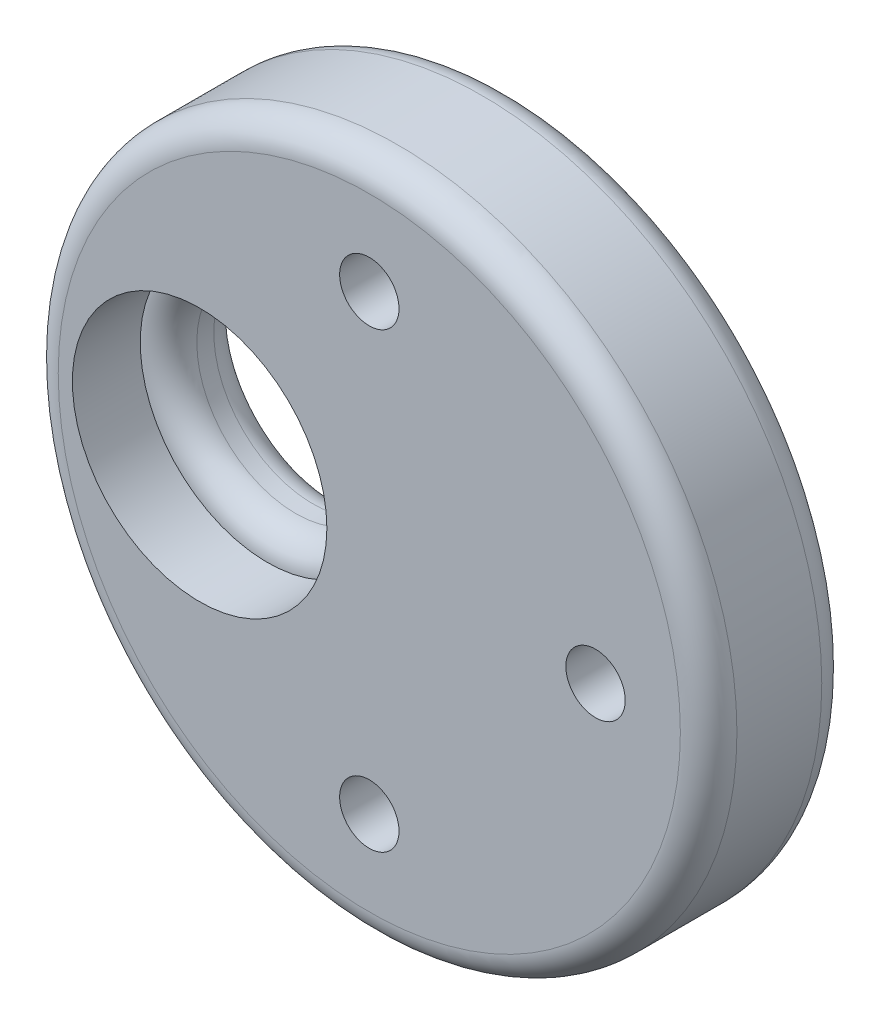
ISO-10303-21;
HEADER;
FILE_DESCRIPTION(('STEP AP214'),'2;1');
FILE_NAME('part.step','',(''),(''),'','','');
FILE_SCHEMA(('AUTOMOTIVE_DESIGN { 1 0 10303 214 1 1 1 1 }'));
ENDSEC;
DATA;
#1=APPLICATION_CONTEXT('core data for automotive mechanical design processes');
#2=APPLICATION_PROTOCOL_DEFINITION('international standard','automotive_design',2000,#1);
#3=PRODUCT_CONTEXT('',#1,'mechanical');
#4=PRODUCT('Part','Part','',(#3));
#5=PRODUCT_RELATED_PRODUCT_CATEGORY('part','',(#4));
#6=PRODUCT_DEFINITION_FORMATION('','',#4);
#7=PRODUCT_DEFINITION_CONTEXT('part definition',#1,'design');
#8=PRODUCT_DEFINITION('design','',#6,#7);
#9=PRODUCT_DEFINITION_SHAPE('','',#8);
#10=(LENGTH_UNIT() NAMED_UNIT(*) SI_UNIT(.MILLI.,.METRE.));
#11=(NAMED_UNIT(*) PLANE_ANGLE_UNIT() SI_UNIT($,.RADIAN.));
#12=(NAMED_UNIT(*) SI_UNIT($,.STERADIAN.) SOLID_ANGLE_UNIT());
#13=UNCERTAINTY_MEASURE_WITH_UNIT(LENGTH_MEASURE(1.E-05),#10,'distance_accuracy_value','');
#14=(GEOMETRIC_REPRESENTATION_CONTEXT(3) GLOBAL_UNCERTAINTY_ASSIGNED_CONTEXT((#13)) GLOBAL_UNIT_ASSIGNED_CONTEXT((#10,
#11,#12)) REPRESENTATION_CONTEXT('',''));
#15=CARTESIAN_POINT('',(0.,0.,0.));
#16=DIRECTION('',(0.,0.,1.));
#17=DIRECTION('',(1.,0.,0.));
#18=AXIS2_PLACEMENT_3D('',#15,#16,#17);
#19=CARTESIAN_POINT('',(8.00000000000028,1.62077717745761E-13,5.));
#20=DIRECTION('',(0.,0.,-1.));
#21=DIRECTION('',(-1.,0.,0.));
#22=AXIS2_PLACEMENT_3D('',#19,#20,#21);
#23=CYLINDRICAL_SURFACE('',#22,1.0500000000001);
#24=CARTESIAN_POINT('',(8.00000000000028,1.62077717745761E-13,5.));
#25=DIRECTION('',(0.,0.,1.));
#26=DIRECTION('',(1.,0.,0.));
#27=AXIS2_PLACEMENT_3D('',#24,#25,#26);
#28=CIRCLE('',#27,1.0500000000001);
#29=CARTESIAN_POINT('',(9.05000000000038,1.62077717745761E-13,5.));
#30=VERTEX_POINT('',#29);
#31=EDGE_CURVE('E77',#30,#30,#28,.T.);
#32=ORIENTED_EDGE('',*,*,#31,.T.);
#33=EDGE_LOOP('',(#32));
#34=FACE_BOUND('',#33,.T.);
#35=CARTESIAN_POINT('',(8.00000000000028,1.62077717745761E-13,3.));
#36=DIRECTION('',(0.,0.,-1.));
#37=DIRECTION('',(-1.,0.,0.));
#38=AXIS2_PLACEMENT_3D('',#35,#36,#37);
#39=CIRCLE('',#38,1.0500000000001);
#40=CARTESIAN_POINT('',(6.95000000000018,1.62077717745761E-13,3.));
#41=VERTEX_POINT('',#40);
#42=EDGE_CURVE('E60',#41,#41,#39,.T.);
#43=ORIENTED_EDGE('',*,*,#42,.T.);
#44=EDGE_LOOP('',(#43));
#45=FACE_BOUND('',#44,.T.);
#46=ADVANCED_FACE('F30',(#34,#45),#23,.F.);
#47=CARTESIAN_POINT('',(3.24155435491522E-13,-8.,5.));
#48=DIRECTION('',(0.,0.,-1.));
#49=DIRECTION('',(-1.,0.,0.));
#50=AXIS2_PLACEMENT_3D('',#47,#48,#49);
#51=CYLINDRICAL_SURFACE('',#50,1.05000000000036);
#52=CARTESIAN_POINT('',(3.24155435491522E-13,-8.,5.));
#53=DIRECTION('',(0.,0.,1.));
#54=DIRECTION('',(1.,0.,0.));
#55=AXIS2_PLACEMENT_3D('',#52,#53,#54);
#56=CIRCLE('',#55,1.05000000000036);
#57=CARTESIAN_POINT('',(1.05000000000069,-8.,5.));
#58=VERTEX_POINT('',#57);
#59=EDGE_CURVE('E80',#58,#58,#56,.T.);
#60=ORIENTED_EDGE('',*,*,#59,.T.);
#61=EDGE_LOOP('',(#60));
#62=FACE_BOUND('',#61,.T.);
#63=CARTESIAN_POINT('',(3.24155435491522E-13,-8.,3.));
#64=DIRECTION('',(0.,0.,-1.));
#65=DIRECTION('',(-1.,0.,0.));
#66=AXIS2_PLACEMENT_3D('',#63,#64,#65);
#67=CIRCLE('',#66,1.05000000000036);
#68=CARTESIAN_POINT('',(-1.05000000000004,-8.,3.));
#69=VERTEX_POINT('',#68);
#70=EDGE_CURVE('E65',#69,#69,#67,.T.);
#71=ORIENTED_EDGE('',*,*,#70,.T.);
#72=EDGE_LOOP('',(#71));
#73=FACE_BOUND('',#72,.T.);
#74=ADVANCED_FACE('F139',(#62,#73),#51,.F.);
#75=CARTESIAN_POINT('',(0.,8.,5.));
#76=DIRECTION('',(0.,0.,-1.));
#77=DIRECTION('',(-1.,0.,0.));
#78=AXIS2_PLACEMENT_3D('',#75,#76,#77);
#79=CYLINDRICAL_SURFACE('',#78,1.05);
#80=CARTESIAN_POINT('',(0.,8.,5.));
#81=DIRECTION('',(0.,0.,1.));
#82=DIRECTION('',(1.,0.,0.));
#83=AXIS2_PLACEMENT_3D('',#80,#81,#82);
#84=CIRCLE('',#83,1.05);
#85=CARTESIAN_POINT('',(1.05,8.,5.));
#86=VERTEX_POINT('',#85);
#87=EDGE_CURVE('E59',#86,#86,#84,.T.);
#88=ORIENTED_EDGE('',*,*,#87,.T.);
#89=EDGE_LOOP('',(#88));
#90=FACE_BOUND('',#89,.T.);
#91=CARTESIAN_POINT('',(0.,8.,3.));
#92=DIRECTION('',(0.,0.,-1.));
#93=DIRECTION('',(-1.,0.,0.));
#94=AXIS2_PLACEMENT_3D('',#91,#92,#93);
#95=CIRCLE('',#94,1.05);
#96=CARTESIAN_POINT('',(-1.05,8.,3.));
#97=VERTEX_POINT('',#96);
#98=EDGE_CURVE('E70',#97,#97,#95,.T.);
#99=ORIENTED_EDGE('',*,*,#98,.T.);
#100=EDGE_LOOP('',(#99));
#101=FACE_BOUND('',#100,.T.);
#102=ADVANCED_FACE('F145',(#90,#101),#79,.F.);
#103=CARTESIAN_POINT('',(0.,0.,5.));
#104=DIRECTION('',(0.,0.,1.));
#105=DIRECTION('',(1.,0.,0.));
#106=AXIS2_PLACEMENT_3D('',#103,#104,#105);
#107=PLANE('',#106);
#108=CARTESIAN_POINT('',(0.,0.,5.));
#109=DIRECTION('',(0.,0.,1.));
#110=DIRECTION('',(1.,0.,0.));
#111=AXIS2_PLACEMENT_3D('',#108,#109,#110);
#112=CIRCLE('',#111,11.);
#113=CARTESIAN_POINT('',(11.,0.,5.));
#114=VERTEX_POINT('',#113);
#115=EDGE_CURVE('E45',#114,#114,#112,.T.);
#116=ORIENTED_EDGE('',*,*,#115,.T.);
#117=EDGE_LOOP('',(#116));
#118=FACE_BOUND('',#117,.T.);
#119=CARTESIAN_POINT('',(-6.,0.,5.));
#120=DIRECTION('',(0.,0.,1.));
#121=DIRECTION('',(1.,0.,0.));
#122=AXIS2_PLACEMENT_3D('',#119,#120,#121);
#123=CIRCLE('',#122,4.50000000000001);
#124=CARTESIAN_POINT('',(-1.49999999999999,0.,5.));
#125=VERTEX_POINT('',#124);
#126=EDGE_CURVE('E73',#125,#125,#123,.T.);
#127=ORIENTED_EDGE('',*,*,#126,.F.);
#128=EDGE_LOOP('',(#127));
#129=FACE_BOUND('',#128,.T.);
#130=ORIENTED_EDGE('',*,*,#31,.F.);
#131=EDGE_LOOP('',(#130));
#132=FACE_BOUND('',#131,.T.);
#133=ORIENTED_EDGE('',*,*,#87,.F.);
#134=EDGE_LOOP('',(#133));
#135=FACE_BOUND('',#134,.T.);
#136=ORIENTED_EDGE('',*,*,#59,.F.);
#137=EDGE_LOOP('',(#136));
#138=FACE_BOUND('',#137,.T.);
#139=ADVANCED_FACE('F115',(#118,#129,#132,#135,#138),#107,.T.);
#140=CARTESIAN_POINT('',(0.,0.,0.));
#141=DIRECTION('',(0.,0.,1.));
#142=DIRECTION('',(1.,0.,0.));
#143=AXIS2_PLACEMENT_3D('',#140,#141,#142);
#144=PLANE('',#143);
#145=CARTESIAN_POINT('',(0.,0.,0.));
#146=DIRECTION('',(0.,0.,1.));
#147=DIRECTION('',(1.,0.,0.));
#148=AXIS2_PLACEMENT_3D('',#145,#146,#147);
#149=CIRCLE('',#148,11.);
#150=CARTESIAN_POINT('',(11.,0.,0.));
#151=VERTEX_POINT('',#150);
#152=EDGE_CURVE('E10',#151,#151,#149,.F.);
#153=ORIENTED_EDGE('',*,*,#152,.T.);
#154=EDGE_LOOP('',(#153));
#155=FACE_BOUND('',#154,.T.);
#156=CARTESIAN_POINT('',(-6.,0.,0.));
#157=DIRECTION('',(0.,0.,1.));
#158=DIRECTION('',(1.,0.,0.));
#159=AXIS2_PLACEMENT_3D('',#156,#157,#158);
#160=CIRCLE('',#159,4.50000000000001);
#161=CARTESIAN_POINT('',(-1.49999999999999,0.,0.));
#162=VERTEX_POINT('',#161);
#163=EDGE_CURVE('E50',#162,#162,#160,.T.);
#164=ORIENTED_EDGE('',*,*,#163,.T.);
#165=EDGE_LOOP('',(#164));
#166=FACE_BOUND('',#165,.T.);
#167=CARTESIAN_POINT('',(8.00000000000028,1.62077717745761E-13,0.));
#168=DIRECTION('',(0.,0.,-1.));
#169=DIRECTION('',(-1.,0.,0.));
#170=AXIS2_PLACEMENT_3D('',#167,#168,#169);
#171=CIRCLE('',#170,2.15);
#172=CARTESIAN_POINT('',(5.85000000000028,1.62077717745761E-13,0.));
#173=VERTEX_POINT('',#172);
#174=EDGE_CURVE('E96',#173,#173,#171,.T.);
#175=ORIENTED_EDGE('',*,*,#174,.F.);
#176=EDGE_LOOP('',(#175));
#177=FACE_BOUND('',#176,.T.);
#178=CARTESIAN_POINT('',(3.24155435491522E-13,-8.,0.));
#179=DIRECTION('',(0.,0.,-1.));
#180=DIRECTION('',(-1.,0.,0.));
#181=AXIS2_PLACEMENT_3D('',#178,#179,#180);
#182=CIRCLE('',#181,2.15);
#183=CARTESIAN_POINT('',(-2.14999999999968,-8.,0.));
#184=VERTEX_POINT('',#183);
#185=EDGE_CURVE('E63',#184,#184,#182,.T.);
#186=ORIENTED_EDGE('',*,*,#185,.F.);
#187=EDGE_LOOP('',(#186));
#188=FACE_BOUND('',#187,.T.);
#189=CARTESIAN_POINT('',(0.,8.,0.));
#190=DIRECTION('',(0.,0.,-1.));
#191=DIRECTION('',(-1.,0.,0.));
#192=AXIS2_PLACEMENT_3D('',#189,#190,#191);
#193=CIRCLE('',#192,2.15);
#194=CARTESIAN_POINT('',(-2.15,8.,0.));
#195=VERTEX_POINT('',#194);
#196=EDGE_CURVE('E68',#195,#195,#193,.T.);
#197=ORIENTED_EDGE('',*,*,#196,.F.);
#198=EDGE_LOOP('',(#197));
#199=FACE_BOUND('',#198,.T.);
#200=ADVANCED_FACE('F111',(#155,#166,#177,#188,#199),#144,.F.);
#201=CARTESIAN_POINT('',(0.,0.,5.));
#202=DIRECTION('',(0.,0.,-1.));
#203=DIRECTION('',(-1.,0.,0.));
#204=AXIS2_PLACEMENT_3D('',#201,#202,#203);
#205=CYLINDRICAL_SURFACE('',#204,12.);
#206=CARTESIAN_POINT('',(0.,0.,4.));
#207=DIRECTION('',(0.,0.,1.));
#208=DIRECTION('',(1.,0.,0.));
#209=AXIS2_PLACEMENT_3D('',#206,#207,#208);
#210=CIRCLE('',#209,12.);
#211=CARTESIAN_POINT('',(12.,0.,4.));
#212=VERTEX_POINT('',#211);
#213=EDGE_CURVE('E37',#212,#212,#210,.F.);
#214=ORIENTED_EDGE('',*,*,#213,.T.);
#215=EDGE_LOOP('',(#214));
#216=FACE_BOUND('',#215,.T.);
#217=CARTESIAN_POINT('',(0.,0.,1.));
#218=DIRECTION('',(0.,0.,1.));
#219=DIRECTION('',(1.,0.,0.));
#220=AXIS2_PLACEMENT_3D('',#217,#218,#219);
#221=CIRCLE('',#220,12.);
#222=CARTESIAN_POINT('',(12.,0.,1.));
#223=VERTEX_POINT('',#222);
#224=EDGE_CURVE('E41',#223,#223,#221,.T.);
#225=ORIENTED_EDGE('',*,*,#224,.T.);
#226=EDGE_LOOP('',(#225));
#227=FACE_BOUND('',#226,.T.);
#228=ADVANCED_FACE('F114',(#216,#227),#205,.T.);
#229=CARTESIAN_POINT('',(-6.,0.,5.));
#230=DIRECTION('',(0.,0.,1.));
#231=DIRECTION('',(1.,0.,0.));
#232=AXIS2_PLACEMENT_3D('',#229,#230,#231);
#233=CYLINDRICAL_SURFACE('',#232,3.50000000000001);
#234=CARTESIAN_POINT('',(-6.,0.,1.6));
#235=DIRECTION('',(0.,0.,-1.));
#236=DIRECTION('',(-1.,0.,0.));
#237=AXIS2_PLACEMENT_3D('',#234,#235,#236);
#238=CIRCLE('',#237,3.50000000000001);
#239=CARTESIAN_POINT('',(-9.50000000000001,0.,1.6));
#240=VERTEX_POINT('',#239);
#241=EDGE_CURVE('E53',#240,#240,#238,.F.);
#242=ORIENTED_EDGE('',*,*,#241,.T.);
#243=EDGE_LOOP('',(#242));
#244=FACE_BOUND('',#243,.T.);
#245=CARTESIAN_POINT('',(-6.,0.,1.));
#246=DIRECTION('',(0.,0.,1.));
#247=DIRECTION('',(1.,0.,0.));
#248=AXIS2_PLACEMENT_3D('',#245,#246,#247);
#249=CIRCLE('',#248,3.50000000000001);
#250=CARTESIAN_POINT('',(-2.49999999999999,0.,1.));
#251=VERTEX_POINT('',#250);
#252=EDGE_CURVE('E56',#251,#251,#249,.F.);
#253=ORIENTED_EDGE('',*,*,#252,.T.);
#254=EDGE_LOOP('',(#253));
#255=FACE_BOUND('',#254,.T.);
#256=ADVANCED_FACE('F134',(#244,#255),#233,.F.);
#257=CARTESIAN_POINT('',(-6.,0.,5.));
#258=DIRECTION('',(0.,0.,1.));
#259=DIRECTION('',(1.,0.,0.));
#260=AXIS2_PLACEMENT_3D('',#257,#258,#259);
#261=CYLINDRICAL_SURFACE('',#260,4.50000000000001);
#262=CARTESIAN_POINT('',(-6.,0.,2.6));
#263=DIRECTION('',(0.,0.,1.));
#264=DIRECTION('',(1.,0.,0.));
#265=AXIS2_PLACEMENT_3D('',#262,#263,#264);
#266=CIRCLE('',#265,4.50000000000001);
#267=CARTESIAN_POINT('',(-1.49999999999999,0.,2.6));
#268=VERTEX_POINT('',#267);
#269=EDGE_CURVE('E83',#268,#268,#266,.T.);
#270=ORIENTED_EDGE('',*,*,#269,.F.);
#271=EDGE_LOOP('',(#270));
#272=FACE_BOUND('',#271,.T.);
#273=ORIENTED_EDGE('',*,*,#126,.T.);
#274=EDGE_LOOP('',(#273));
#275=FACE_BOUND('',#274,.T.);
#276=ADVANCED_FACE('F124',(#272,#275),#261,.F.);
#277=CARTESIAN_POINT('',(0.,8.,3.));
#278=DIRECTION('',(0.,0.,-1.));
#279=DIRECTION('',(-1.,0.,0.));
#280=AXIS2_PLACEMENT_3D('',#277,#278,#279);
#281=CYLINDRICAL_SURFACE('',#280,2.15);
#282=CARTESIAN_POINT('',(0.,8.,3.));
#283=DIRECTION('',(0.,0.,-1.));
#284=DIRECTION('',(-1.,0.,0.));
#285=AXIS2_PLACEMENT_3D('',#282,#283,#284);
#286=CIRCLE('',#285,2.15);
#287=CARTESIAN_POINT('',(-2.15,8.,3.));
#288=VERTEX_POINT('',#287);
#289=EDGE_CURVE('E74',#288,#288,#286,.T.);
#290=ORIENTED_EDGE('',*,*,#289,.F.);
#291=EDGE_LOOP('',(#290));
#292=FACE_BOUND('',#291,.T.);
#293=ORIENTED_EDGE('',*,*,#196,.T.);
#294=EDGE_LOOP('',(#293));
#295=FACE_BOUND('',#294,.T.);
#296=ADVANCED_FACE('F121',(#292,#295),#281,.F.);
#297=CARTESIAN_POINT('',(0.,8.,3.));
#298=DIRECTION('',(0.,0.,-1.));
#299=DIRECTION('',(-1.,0.,0.));
#300=AXIS2_PLACEMENT_3D('',#297,#298,#299);
#301=PLANE('',#300);
#302=ORIENTED_EDGE('',*,*,#98,.F.);
#303=EDGE_LOOP('',(#302));
#304=FACE_BOUND('',#303,.T.);
#305=ORIENTED_EDGE('',*,*,#289,.T.);
#306=EDGE_LOOP('',(#305));
#307=FACE_BOUND('',#306,.T.);
#308=ADVANCED_FACE('F123',(#304,#307),#301,.T.);
#309=CARTESIAN_POINT('',(3.24155435491522E-13,-8.,3.));
#310=DIRECTION('',(0.,0.,-1.));
#311=DIRECTION('',(-1.,0.,0.));
#312=AXIS2_PLACEMENT_3D('',#309,#310,#311);
#313=CYLINDRICAL_SURFACE('',#312,2.15);
#314=CARTESIAN_POINT('',(3.24155435491522E-13,-8.,3.));
#315=DIRECTION('',(0.,0.,-1.));
#316=DIRECTION('',(-1.,0.,0.));
#317=AXIS2_PLACEMENT_3D('',#314,#315,#316);
#318=CIRCLE('',#317,2.15);
#319=CARTESIAN_POINT('',(-2.14999999999968,-8.,3.));
#320=VERTEX_POINT('',#319);
#321=EDGE_CURVE('E69',#320,#320,#318,.T.);
#322=ORIENTED_EDGE('',*,*,#321,.F.);
#323=EDGE_LOOP('',(#322));
#324=FACE_BOUND('',#323,.T.);
#325=ORIENTED_EDGE('',*,*,#185,.T.);
#326=EDGE_LOOP('',(#325));
#327=FACE_BOUND('',#326,.T.);
#328=ADVANCED_FACE('F131',(#324,#327),#313,.F.);
#329=CARTESIAN_POINT('',(3.24155435491522E-13,-8.,3.));
#330=DIRECTION('',(0.,0.,-1.));
#331=DIRECTION('',(-1.,0.,0.));
#332=AXIS2_PLACEMENT_3D('',#329,#330,#331);
#333=PLANE('',#332);
#334=ORIENTED_EDGE('',*,*,#70,.F.);
#335=EDGE_LOOP('',(#334));
#336=FACE_BOUND('',#335,.T.);
#337=ORIENTED_EDGE('',*,*,#321,.T.);
#338=EDGE_LOOP('',(#337));
#339=FACE_BOUND('',#338,.T.);
#340=ADVANCED_FACE('F107',(#336,#339),#333,.T.);
#341=CARTESIAN_POINT('',(8.00000000000028,1.62077717745761E-13,3.));
#342=DIRECTION('',(0.,0.,-1.));
#343=DIRECTION('',(-1.,0.,0.));
#344=AXIS2_PLACEMENT_3D('',#341,#342,#343);
#345=CYLINDRICAL_SURFACE('',#344,2.15);
#346=CARTESIAN_POINT('',(8.00000000000028,1.62077717745761E-13,3.));
#347=DIRECTION('',(0.,0.,-1.));
#348=DIRECTION('',(-1.,0.,0.));
#349=AXIS2_PLACEMENT_3D('',#346,#347,#348);
#350=CIRCLE('',#349,2.15);
#351=CARTESIAN_POINT('',(5.85000000000028,1.62077717745761E-13,3.));
#352=VERTEX_POINT('',#351);
#353=EDGE_CURVE('E64',#352,#352,#350,.T.);
#354=ORIENTED_EDGE('',*,*,#353,.F.);
#355=EDGE_LOOP('',(#354));
#356=FACE_BOUND('',#355,.T.);
#357=ORIENTED_EDGE('',*,*,#174,.T.);
#358=EDGE_LOOP('',(#357));
#359=FACE_BOUND('',#358,.T.);
#360=ADVANCED_FACE('F104',(#356,#359),#345,.F.);
#361=CARTESIAN_POINT('',(8.00000000000028,1.62077717745761E-13,3.));
#362=DIRECTION('',(0.,0.,-1.));
#363=DIRECTION('',(-1.,0.,0.));
#364=AXIS2_PLACEMENT_3D('',#361,#362,#363);
#365=PLANE('',#364);
#366=ORIENTED_EDGE('',*,*,#42,.F.);
#367=EDGE_LOOP('',(#366));
#368=FACE_BOUND('',#367,.T.);
#369=ORIENTED_EDGE('',*,*,#353,.T.);
#370=EDGE_LOOP('',(#369));
#371=FACE_BOUND('',#370,.T.);
#372=ADVANCED_FACE('F102',(#368,#371),#365,.T.);
#373=CARTESIAN_POINT('',(-6.,0.,1.6));
#374=DIRECTION('',(0.,0.,-1.));
#375=DIRECTION('',(-1.,0.,0.));
#376=AXIS2_PLACEMENT_3D('',#373,#374,#375);
#377=TOROIDAL_SURFACE('',#376,4.50000000000001,1.);
#378=ORIENTED_EDGE('',*,*,#269,.T.);
#379=EDGE_LOOP('',(#378));
#380=FACE_BOUND('',#379,.T.);
#381=ORIENTED_EDGE('',*,*,#241,.F.);
#382=EDGE_LOOP('',(#381));
#383=FACE_BOUND('',#382,.T.);
#384=ADVANCED_FACE('F159',(#380,#383),#377,.T.);
#385=CARTESIAN_POINT('',(-6.,0.,1.));
#386=DIRECTION('',(0.,0.,1.));
#387=DIRECTION('',(1.,0.,0.));
#388=AXIS2_PLACEMENT_3D('',#385,#386,#387);
#389=TOROIDAL_SURFACE('',#388,4.50000000000001,1.);
#390=ORIENTED_EDGE('',*,*,#252,.F.);
#391=EDGE_LOOP('',(#390));
#392=FACE_BOUND('',#391,.T.);
#393=ORIENTED_EDGE('',*,*,#163,.F.);
#394=EDGE_LOOP('',(#393));
#395=FACE_BOUND('',#394,.T.);
#396=ADVANCED_FACE('F162',(#392,#395),#389,.T.);
#397=CARTESIAN_POINT('',(0.,0.,4.));
#398=DIRECTION('',(0.,0.,1.));
#399=DIRECTION('',(1.,0.,0.));
#400=AXIS2_PLACEMENT_3D('',#397,#398,#399);
#401=TOROIDAL_SURFACE('',#400,11.,1.);
#402=ORIENTED_EDGE('',*,*,#213,.F.);
#403=EDGE_LOOP('',(#402));
#404=FACE_BOUND('',#403,.T.);
#405=ORIENTED_EDGE('',*,*,#115,.F.);
#406=EDGE_LOOP('',(#405));
#407=FACE_BOUND('',#406,.T.);
#408=ADVANCED_FACE('F165',(#404,#407),#401,.T.);
#409=CARTESIAN_POINT('',(0.,0.,1.));
#410=DIRECTION('',(0.,0.,1.));
#411=DIRECTION('',(1.,0.,0.));
#412=AXIS2_PLACEMENT_3D('',#409,#410,#411);
#413=TOROIDAL_SURFACE('',#412,11.,1.);
#414=ORIENTED_EDGE('',*,*,#152,.F.);
#415=EDGE_LOOP('',(#414));
#416=FACE_BOUND('',#415,.T.);
#417=ORIENTED_EDGE('',*,*,#224,.F.);
#418=EDGE_LOOP('',(#417));
#419=FACE_BOUND('',#418,.T.);
#420=ADVANCED_FACE('F32',(#416,#419),#413,.T.);
#421=CLOSED_SHELL('',(#46,#74,#102,#139,#200,#228,#256,#276,#296,#308,#328,#340,#360,#372,#384,
#396,#408,#420));
#422=MANIFOLD_SOLID_BREP('B2',#421);
#423=ADVANCED_BREP_SHAPE_REPRESENTATION('',(#18,#422),#14);
#424=SHAPE_DEFINITION_REPRESENTATION(#9,#423);
ENDSEC;
END-ISO-10303-21;
